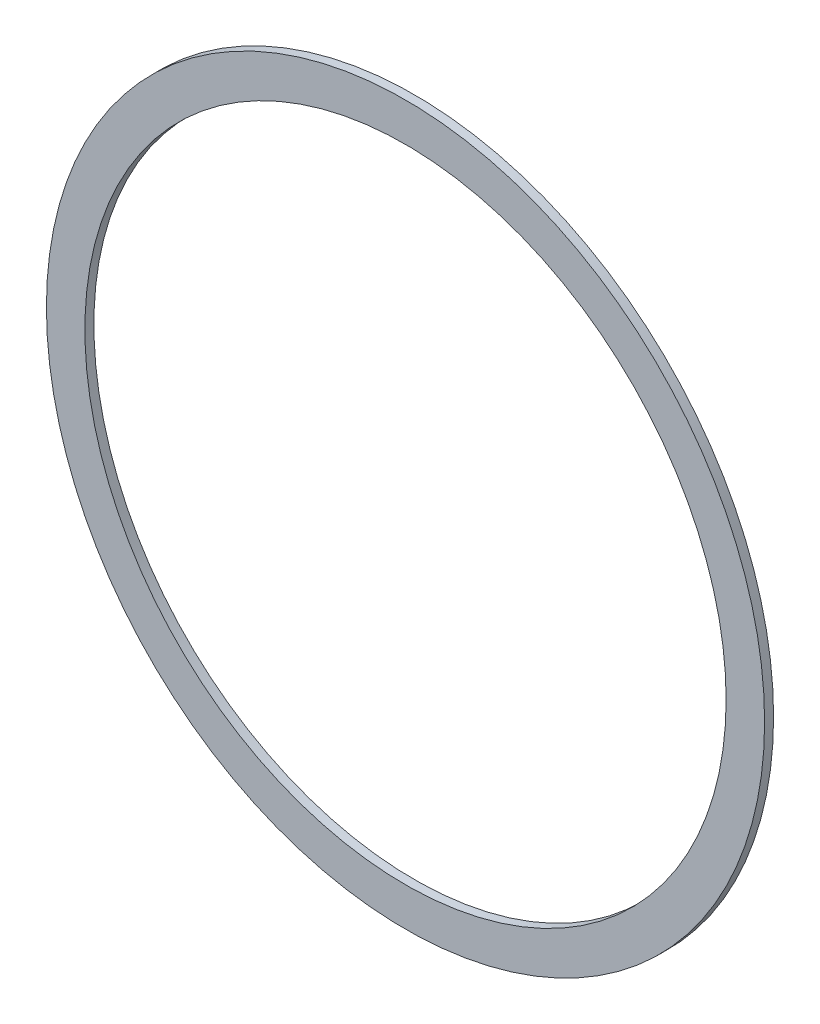
ISO-10303-21;
HEADER;
FILE_DESCRIPTION(('STEP AP214'),'2;1');
FILE_NAME('part.step','',(''),(''),'','','');
FILE_SCHEMA(('AUTOMOTIVE_DESIGN { 1 0 10303 214 1 1 1 1 }'));
ENDSEC;
DATA;
#1=APPLICATION_CONTEXT('core data for automotive mechanical design processes');
#2=APPLICATION_PROTOCOL_DEFINITION('international standard','automotive_design',2000,#1);
#3=PRODUCT_CONTEXT('',#1,'mechanical');
#4=PRODUCT('Part','Part','',(#3));
#5=PRODUCT_RELATED_PRODUCT_CATEGORY('part','',(#4));
#6=PRODUCT_DEFINITION_FORMATION('','',#4);
#7=PRODUCT_DEFINITION_CONTEXT('part definition',#1,'design');
#8=PRODUCT_DEFINITION('design','',#6,#7);
#9=PRODUCT_DEFINITION_SHAPE('','',#8);
#10=(LENGTH_UNIT() NAMED_UNIT(*) SI_UNIT(.MILLI.,.METRE.));
#11=(NAMED_UNIT(*) PLANE_ANGLE_UNIT() SI_UNIT($,.RADIAN.));
#12=(NAMED_UNIT(*) SI_UNIT($,.STERADIAN.) SOLID_ANGLE_UNIT());
#13=UNCERTAINTY_MEASURE_WITH_UNIT(LENGTH_MEASURE(1.E-05),#10,'distance_accuracy_value','');
#14=(GEOMETRIC_REPRESENTATION_CONTEXT(3) GLOBAL_UNCERTAINTY_ASSIGNED_CONTEXT((#13)) GLOBAL_UNIT_ASSIGNED_CONTEXT((#10,
#11,#12)) REPRESENTATION_CONTEXT('',''));
#15=CARTESIAN_POINT('',(0.,0.,0.));
#16=DIRECTION('',(0.,0.,1.));
#17=DIRECTION('',(1.,0.,0.));
#18=AXIS2_PLACEMENT_3D('',#15,#16,#17);
#19=CARTESIAN_POINT('',(0.,0.,0.));
#20=DIRECTION('',(0.,0.,1.));
#21=DIRECTION('',(1.,0.,0.));
#22=AXIS2_PLACEMENT_3D('',#19,#20,#21);
#23=CYLINDRICAL_SURFACE('',#22,12.5);
#24=CARTESIAN_POINT('',(0.,0.,-0.35));
#25=DIRECTION('',(0.,0.,1.));
#26=DIRECTION('',(1.,0.,0.));
#27=AXIS2_PLACEMENT_3D('',#24,#25,#26);
#28=CIRCLE('',#27,12.5);
#29=CARTESIAN_POINT('',(12.5,0.,-0.35));
#30=VERTEX_POINT('',#29);
#31=EDGE_CURVE('E47',#30,#30,#28,.T.);
#32=ORIENTED_EDGE('',*,*,#31,.F.);
#33=EDGE_LOOP('',(#32));
#34=FACE_BOUND('',#33,.T.);
#35=CARTESIAN_POINT('',(0.,0.,0.));
#36=DIRECTION('',(0.,0.,1.));
#37=DIRECTION('',(1.,0.,0.));
#38=AXIS2_PLACEMENT_3D('',#35,#36,#37);
#39=CIRCLE('',#38,12.5);
#40=CARTESIAN_POINT('',(12.5,0.,0.));
#41=VERTEX_POINT('',#40);
#42=EDGE_CURVE('E10',#41,#41,#39,.T.);
#43=ORIENTED_EDGE('',*,*,#42,.T.);
#44=EDGE_LOOP('',(#43));
#45=FACE_BOUND('',#44,.T.);
#46=ADVANCED_FACE('F33',(#34,#45),#23,.F.);
#47=CARTESIAN_POINT('',(0.,12.5,0.));
#48=DIRECTION('',(0.,0.,-1.));
#49=DIRECTION('',(-1.,0.,0.));
#50=AXIS2_PLACEMENT_3D('',#47,#48,#49);
#51=PLANE('',#50);
#52=ORIENTED_EDGE('',*,*,#42,.F.);
#53=EDGE_LOOP('',(#52));
#54=FACE_BOUND('',#53,.T.);
#55=CARTESIAN_POINT('',(0.,0.,0.));
#56=DIRECTION('',(0.,0.,1.));
#57=DIRECTION('',(1.,0.,0.));
#58=AXIS2_PLACEMENT_3D('',#55,#56,#57);
#59=CIRCLE('',#58,14.);
#60=CARTESIAN_POINT('',(14.,0.,0.));
#61=VERTEX_POINT('',#60);
#62=EDGE_CURVE('E39',#61,#61,#59,.T.);
#63=ORIENTED_EDGE('',*,*,#62,.T.);
#64=EDGE_LOOP('',(#63));
#65=FACE_BOUND('',#64,.T.);
#66=ADVANCED_FACE('F56',(#54,#65),#51,.F.);
#67=CARTESIAN_POINT('',(0.,0.,0.));
#68=DIRECTION('',(0.,0.,1.));
#69=DIRECTION('',(1.,0.,0.));
#70=AXIS2_PLACEMENT_3D('',#67,#68,#69);
#71=CYLINDRICAL_SURFACE('',#70,14.);
#72=ORIENTED_EDGE('',*,*,#62,.F.);
#73=EDGE_LOOP('',(#72));
#74=FACE_BOUND('',#73,.T.);
#75=CARTESIAN_POINT('',(0.,0.,-0.35));
#76=DIRECTION('',(0.,0.,1.));
#77=DIRECTION('',(1.,0.,0.));
#78=AXIS2_PLACEMENT_3D('',#75,#76,#77);
#79=CIRCLE('',#78,14.);
#80=CARTESIAN_POINT('',(14.,0.,-0.35));
#81=VERTEX_POINT('',#80);
#82=EDGE_CURVE('E43',#81,#81,#79,.T.);
#83=ORIENTED_EDGE('',*,*,#82,.T.);
#84=EDGE_LOOP('',(#83));
#85=FACE_BOUND('',#84,.T.);
#86=ADVANCED_FACE('F60',(#74,#85),#71,.T.);
#87=CARTESIAN_POINT('',(0.,14.,-0.35));
#88=DIRECTION('',(0.,0.,1.));
#89=DIRECTION('',(1.,0.,0.));
#90=AXIS2_PLACEMENT_3D('',#87,#88,#89);
#91=PLANE('',#90);
#92=ORIENTED_EDGE('',*,*,#82,.F.);
#93=EDGE_LOOP('',(#92));
#94=FACE_BOUND('',#93,.T.);
#95=ORIENTED_EDGE('',*,*,#31,.T.);
#96=EDGE_LOOP('',(#95));
#97=FACE_BOUND('',#96,.T.);
#98=ADVANCED_FACE('F53',(#94,#97),#91,.F.);
#99=CLOSED_SHELL('',(#46,#66,#86,#98));
#100=MANIFOLD_SOLID_BREP('B2',#99);
#101=ADVANCED_BREP_SHAPE_REPRESENTATION('',(#18,#100),#14);
#102=SHAPE_DEFINITION_REPRESENTATION(#9,#101);
ENDSEC;
END-ISO-10303-21;
